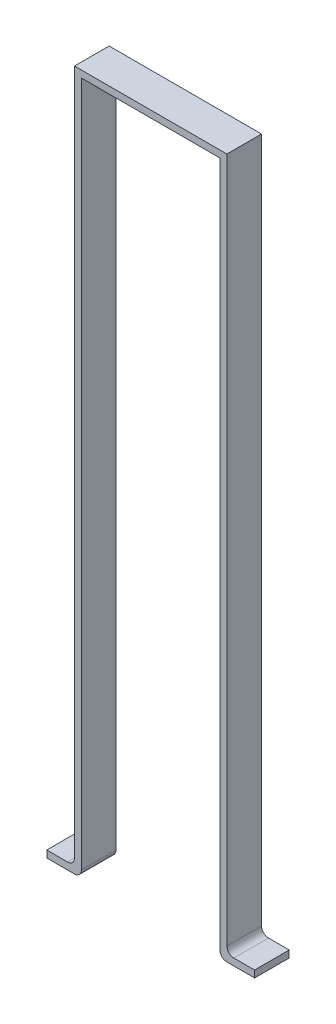
ISO-10303-21;
HEADER;
FILE_DESCRIPTION(('STEP AP214'),'2;1');
FILE_NAME('part.step','',(''),(''),'','','');
FILE_SCHEMA(('AUTOMOTIVE_DESIGN { 1 0 10303 214 1 1 1 1 }'));
ENDSEC;
DATA;
#1=APPLICATION_CONTEXT('core data for automotive mechanical design processes');
#2=APPLICATION_PROTOCOL_DEFINITION('international standard','automotive_design',2000,#1);
#3=PRODUCT_CONTEXT('',#1,'mechanical');
#4=PRODUCT('Part','Part','',(#3));
#5=PRODUCT_RELATED_PRODUCT_CATEGORY('part','',(#4));
#6=PRODUCT_DEFINITION_FORMATION('','',#4);
#7=PRODUCT_DEFINITION_CONTEXT('part definition',#1,'design');
#8=PRODUCT_DEFINITION('design','',#6,#7);
#9=PRODUCT_DEFINITION_SHAPE('','',#8);
#10=(LENGTH_UNIT() NAMED_UNIT(*) SI_UNIT(.MILLI.,.METRE.));
#11=(NAMED_UNIT(*) PLANE_ANGLE_UNIT() SI_UNIT($,.RADIAN.));
#12=(NAMED_UNIT(*) SI_UNIT($,.STERADIAN.) SOLID_ANGLE_UNIT());
#13=UNCERTAINTY_MEASURE_WITH_UNIT(LENGTH_MEASURE(1.E-05),#10,'distance_accuracy_value','');
#14=(GEOMETRIC_REPRESENTATION_CONTEXT(3) GLOBAL_UNCERTAINTY_ASSIGNED_CONTEXT((#13)) GLOBAL_UNIT_ASSIGNED_CONTEXT((#10,
#11,#12)) REPRESENTATION_CONTEXT('',''));
#15=CARTESIAN_POINT('',(0.,0.,0.));
#16=DIRECTION('',(0.,0.,1.));
#17=DIRECTION('',(1.,0.,0.));
#18=AXIS2_PLACEMENT_3D('',#15,#16,#17);
#19=CARTESIAN_POINT('',(-25.4,2.54000000000002,12.7));
#20=DIRECTION('',(-1.,0.,0.));
#21=DIRECTION('',(0.,-1.,0.));
#22=AXIS2_PLACEMENT_3D('',#19,#20,#21);
#23=PLANE('',#22);
#24=DIRECTION('',(0.,1.,0.));
#25=VECTOR('',#24,1.);
#26=CARTESIAN_POINT('',(-25.4,2.54000000000002,0.));
#27=LINE('',#26,#25);
#28=CARTESIAN_POINT('',(-25.4,2.54,0.));
#29=VERTEX_POINT('',#28);
#30=CARTESIAN_POINT('',(-25.4000000000001,254.,0.));
#31=VERTEX_POINT('',#30);
#32=EDGE_CURVE('E176',#29,#31,#27,.T.);
#33=ORIENTED_EDGE('',*,*,#32,.T.);
#34=DIRECTION('',(0.,0.,-1.));
#35=VECTOR('',#34,1.);
#36=CARTESIAN_POINT('',(-25.4000000000001,254.,12.7));
#37=LINE('',#36,#35);
#38=CARTESIAN_POINT('',(-25.4000000000001,254.,12.7));
#39=VERTEX_POINT('',#38);
#40=EDGE_CURVE('E11',#39,#31,#37,.T.);
#41=ORIENTED_EDGE('',*,*,#40,.F.);
#42=DIRECTION('',(0.,1.,0.));
#43=VECTOR('',#42,1.);
#44=CARTESIAN_POINT('',(-25.4,2.54000000000002,12.7));
#45=LINE('',#44,#43);
#46=CARTESIAN_POINT('',(-25.4,2.54,12.7));
#47=VERTEX_POINT('',#46);
#48=EDGE_CURVE('E216',#47,#39,#45,.T.);
#49=ORIENTED_EDGE('',*,*,#48,.F.);
#50=DIRECTION('',(0.,0.,-1.));
#51=VECTOR('',#50,1.);
#52=CARTESIAN_POINT('',(-25.4,2.54,12.7));
#53=LINE('',#52,#51);
#54=EDGE_CURVE('E172',#47,#29,#53,.T.);
#55=ORIENTED_EDGE('',*,*,#54,.T.);
#56=EDGE_LOOP('',(#33,#41,#49,#55));
#57=FACE_BOUND('',#56,.T.);
#58=ADVANCED_FACE('F33',(#57),#23,.F.);
#59=CARTESIAN_POINT('',(-25.4000000000001,254.,12.7));
#60=DIRECTION('',(0.,1.,0.));
#61=DIRECTION('',(0.,0.,1.));
#62=AXIS2_PLACEMENT_3D('',#59,#60,#61);
#63=PLANE('',#62);
#64=DIRECTION('',(1.,0.,0.));
#65=VECTOR('',#64,1.);
#66=CARTESIAN_POINT('',(-25.4000000000001,254.,0.));
#67=LINE('',#66,#65);
#68=CARTESIAN_POINT('',(25.4,254.,0.));
#69=VERTEX_POINT('',#68);
#70=EDGE_CURVE('E179',#31,#69,#67,.T.);
#71=ORIENTED_EDGE('',*,*,#70,.T.);
#72=DIRECTION('',(0.,0.,-1.));
#73=VECTOR('',#72,1.);
#74=CARTESIAN_POINT('',(25.4,254.,12.7));
#75=LINE('',#74,#73);
#76=CARTESIAN_POINT('',(25.4,254.,12.7));
#77=VERTEX_POINT('',#76);
#78=EDGE_CURVE('E41',#77,#69,#75,.T.);
#79=ORIENTED_EDGE('',*,*,#78,.F.);
#80=DIRECTION('',(1.,0.,0.));
#81=VECTOR('',#80,1.);
#82=CARTESIAN_POINT('',(-25.4000000000001,254.,12.7));
#83=LINE('',#82,#81);
#84=EDGE_CURVE('E112',#39,#77,#83,.T.);
#85=ORIENTED_EDGE('',*,*,#84,.F.);
#86=ORIENTED_EDGE('',*,*,#40,.T.);
#87=EDGE_LOOP('',(#71,#79,#85,#86));
#88=FACE_BOUND('',#87,.T.);
#89=ADVANCED_FACE('F306',(#88),#63,.F.);
#90=CARTESIAN_POINT('',(25.4,254.,12.7));
#91=DIRECTION('',(1.,0.,0.));
#92=DIRECTION('',(0.,1.,0.));
#93=AXIS2_PLACEMENT_3D('',#90,#91,#92);
#94=PLANE('',#93);
#95=DIRECTION('',(0.,-1.,0.));
#96=VECTOR('',#95,1.);
#97=CARTESIAN_POINT('',(25.4,254.,0.));
#98=LINE('',#97,#96);
#99=CARTESIAN_POINT('',(25.4,2.54000000000002,0.));
#100=VERTEX_POINT('',#99);
#101=EDGE_CURVE('E181',#69,#100,#98,.T.);
#102=ORIENTED_EDGE('',*,*,#101,.T.);
#103=DIRECTION('',(0.,0.,-1.));
#104=VECTOR('',#103,1.);
#105=CARTESIAN_POINT('',(25.4,2.54000000000002,12.7));
#106=LINE('',#105,#104);
#107=CARTESIAN_POINT('',(25.4,2.54000000000002,12.7));
#108=VERTEX_POINT('',#107);
#109=EDGE_CURVE('E239',#108,#100,#106,.T.);
#110=ORIENTED_EDGE('',*,*,#109,.F.);
#111=DIRECTION('',(0.,-1.,0.));
#112=VECTOR('',#111,1.);
#113=CARTESIAN_POINT('',(25.4,254.,12.7));
#114=LINE('',#113,#112);
#115=EDGE_CURVE('E246',#77,#108,#114,.T.);
#116=ORIENTED_EDGE('',*,*,#115,.F.);
#117=ORIENTED_EDGE('',*,*,#78,.T.);
#118=EDGE_LOOP('',(#102,#110,#116,#117));
#119=FACE_BOUND('',#118,.T.);
#120=ADVANCED_FACE('F244',(#119),#94,.F.);
#121=CARTESIAN_POINT('',(27.94,2.54000000000001,12.7));
#122=DIRECTION('',(0.,0.,-1.));
#123=DIRECTION('',(-1.,0.,0.));
#124=AXIS2_PLACEMENT_3D('',#121,#122,#123);
#125=CYLINDRICAL_SURFACE('',#124,2.54);
#126=CARTESIAN_POINT('',(27.94,2.54000000000001,0.));
#127=DIRECTION('',(0.,0.,-1.));
#128=DIRECTION('',(-1.,0.,0.));
#129=AXIS2_PLACEMENT_3D('',#126,#127,#128);
#130=CIRCLE('',#129,2.54);
#131=CARTESIAN_POINT('',(27.94,0.,0.));
#132=VERTEX_POINT('',#131);
#133=EDGE_CURVE('E184',#132,#100,#130,.T.);
#134=ORIENTED_EDGE('',*,*,#133,.F.);
#135=DIRECTION('',(0.,0.,-1.));
#136=VECTOR('',#135,1.);
#137=CARTESIAN_POINT('',(27.94,0.,12.7));
#138=LINE('',#137,#136);
#139=CARTESIAN_POINT('',(27.94,0.,12.7));
#140=VERTEX_POINT('',#139);
#141=EDGE_CURVE('E237',#140,#132,#138,.T.);
#142=ORIENTED_EDGE('',*,*,#141,.F.);
#143=CARTESIAN_POINT('',(27.94,2.54000000000001,12.7));
#144=DIRECTION('',(0.,0.,-1.));
#145=DIRECTION('',(-1.,0.,0.));
#146=AXIS2_PLACEMENT_3D('',#143,#144,#145);
#147=CIRCLE('',#146,2.54);
#148=EDGE_CURVE('E257',#140,#108,#147,.T.);
#149=ORIENTED_EDGE('',*,*,#148,.T.);
#150=ORIENTED_EDGE('',*,*,#109,.T.);
#151=EDGE_LOOP('',(#134,#142,#149,#150));
#152=FACE_BOUND('',#151,.T.);
#153=ADVANCED_FACE('F253',(#152),#125,.T.);
#154=CARTESIAN_POINT('',(27.94,0.,12.7));
#155=DIRECTION('',(0.,1.,0.));
#156=DIRECTION('',(-1.,0.,0.));
#157=AXIS2_PLACEMENT_3D('',#154,#155,#156);
#158=PLANE('',#157);
#159=DIRECTION('',(1.,0.,0.));
#160=VECTOR('',#159,1.);
#161=CARTESIAN_POINT('',(27.94,0.,0.));
#162=LINE('',#161,#160);
#163=CARTESIAN_POINT('',(38.1,0.,0.));
#164=VERTEX_POINT('',#163);
#165=EDGE_CURVE('E187',#132,#164,#162,.T.);
#166=ORIENTED_EDGE('',*,*,#165,.T.);
#167=DIRECTION('',(0.,0.,-1.));
#168=VECTOR('',#167,1.);
#169=CARTESIAN_POINT('',(38.1,0.,12.7));
#170=LINE('',#169,#168);
#171=CARTESIAN_POINT('',(38.1,0.,12.7));
#172=VERTEX_POINT('',#171);
#173=EDGE_CURVE('E235',#172,#164,#170,.T.);
#174=ORIENTED_EDGE('',*,*,#173,.F.);
#175=DIRECTION('',(1.,0.,0.));
#176=VECTOR('',#175,1.);
#177=CARTESIAN_POINT('',(27.94,0.,12.7));
#178=LINE('',#177,#176);
#179=EDGE_CURVE('E258',#140,#172,#178,.T.);
#180=ORIENTED_EDGE('',*,*,#179,.F.);
#181=ORIENTED_EDGE('',*,*,#141,.T.);
#182=EDGE_LOOP('',(#166,#174,#180,#181));
#183=FACE_BOUND('',#182,.T.);
#184=ADVANCED_FACE('F317',(#183),#158,.F.);
#185=CARTESIAN_POINT('',(38.1,2.54,12.7));
#186=DIRECTION('',(1.,0.,0.));
#187=DIRECTION('',(0.,0.,-1.));
#188=AXIS2_PLACEMENT_3D('',#185,#186,#187);
#189=PLANE('',#188);
#190=DIRECTION('',(0.,-1.,0.));
#191=VECTOR('',#190,1.);
#192=CARTESIAN_POINT('',(38.1,2.54,0.));
#193=LINE('',#192,#191);
#194=CARTESIAN_POINT('',(38.1,2.54,0.));
#195=VERTEX_POINT('',#194);
#196=EDGE_CURVE('E190',#195,#164,#193,.T.);
#197=ORIENTED_EDGE('',*,*,#196,.F.);
#198=DIRECTION('',(0.,0.,-1.));
#199=VECTOR('',#198,1.);
#200=CARTESIAN_POINT('',(38.1,2.54,12.7));
#201=LINE('',#200,#199);
#202=CARTESIAN_POINT('',(38.1,2.54,12.7));
#203=VERTEX_POINT('',#202);
#204=EDGE_CURVE('E233',#203,#195,#201,.T.);
#205=ORIENTED_EDGE('',*,*,#204,.F.);
#206=DIRECTION('',(0.,-1.,0.));
#207=VECTOR('',#206,1.);
#208=CARTESIAN_POINT('',(38.1,2.54,12.7));
#209=LINE('',#208,#207);
#210=EDGE_CURVE('E260',#203,#172,#209,.T.);
#211=ORIENTED_EDGE('',*,*,#210,.T.);
#212=ORIENTED_EDGE('',*,*,#173,.T.);
#213=EDGE_LOOP('',(#197,#205,#211,#212));
#214=FACE_BOUND('',#213,.T.);
#215=ADVANCED_FACE('F320',(#214),#189,.T.);
#216=CARTESIAN_POINT('',(30.48,2.54000000000001,12.7));
#217=DIRECTION('',(0.,1.,0.));
#218=DIRECTION('',(-1.,0.,0.));
#219=AXIS2_PLACEMENT_3D('',#216,#217,#218);
#220=PLANE('',#219);
#221=DIRECTION('',(1.,0.,0.));
#222=VECTOR('',#221,1.);
#223=CARTESIAN_POINT('',(30.48,2.54000000000001,0.));
#224=LINE('',#223,#222);
#225=CARTESIAN_POINT('',(30.48,2.54000000000001,0.));
#226=VERTEX_POINT('',#225);
#227=EDGE_CURVE('E193',#226,#195,#224,.T.);
#228=ORIENTED_EDGE('',*,*,#227,.F.);
#229=DIRECTION('',(0.,0.,-1.));
#230=VECTOR('',#229,1.);
#231=CARTESIAN_POINT('',(30.48,2.54000000000001,12.7));
#232=LINE('',#231,#230);
#233=CARTESIAN_POINT('',(30.48,2.54000000000001,12.7));
#234=VERTEX_POINT('',#233);
#235=EDGE_CURVE('E231',#234,#226,#232,.T.);
#236=ORIENTED_EDGE('',*,*,#235,.F.);
#237=DIRECTION('',(1.,0.,0.));
#238=VECTOR('',#237,1.);
#239=CARTESIAN_POINT('',(30.48,2.54000000000001,12.7));
#240=LINE('',#239,#238);
#241=EDGE_CURVE('E267',#234,#203,#240,.T.);
#242=ORIENTED_EDGE('',*,*,#241,.T.);
#243=ORIENTED_EDGE('',*,*,#204,.T.);
#244=EDGE_LOOP('',(#228,#236,#242,#243));
#245=FACE_BOUND('',#244,.T.);
#246=ADVANCED_FACE('F324',(#245),#220,.T.);
#247=CARTESIAN_POINT('',(30.48,5.08000000000001,12.7));
#248=DIRECTION('',(0.,0.,-1.));
#249=DIRECTION('',(-1.,0.,0.));
#250=AXIS2_PLACEMENT_3D('',#247,#248,#249);
#251=CYLINDRICAL_SURFACE('',#250,2.54);
#252=CARTESIAN_POINT('',(30.48,5.08000000000001,0.));
#253=DIRECTION('',(0.,0.,-1.));
#254=DIRECTION('',(-1.,0.,0.));
#255=AXIS2_PLACEMENT_3D('',#252,#253,#254);
#256=CIRCLE('',#255,2.54);
#257=CARTESIAN_POINT('',(27.94,5.08000000000001,0.));
#258=VERTEX_POINT('',#257);
#259=EDGE_CURVE('E196',#226,#258,#256,.T.);
#260=ORIENTED_EDGE('',*,*,#259,.T.);
#261=DIRECTION('',(0.,0.,-1.));
#262=VECTOR('',#261,1.);
#263=CARTESIAN_POINT('',(27.94,5.08000000000001,12.7));
#264=LINE('',#263,#262);
#265=CARTESIAN_POINT('',(27.94,5.08000000000001,12.7));
#266=VERTEX_POINT('',#265);
#267=EDGE_CURVE('E229',#266,#258,#264,.T.);
#268=ORIENTED_EDGE('',*,*,#267,.F.);
#269=CARTESIAN_POINT('',(30.48,5.08000000000001,12.7));
#270=DIRECTION('',(0.,0.,-1.));
#271=DIRECTION('',(-1.,0.,0.));
#272=AXIS2_PLACEMENT_3D('',#269,#270,#271);
#273=CIRCLE('',#272,2.54);
#274=EDGE_CURVE('E270',#234,#266,#273,.T.);
#275=ORIENTED_EDGE('',*,*,#274,.F.);
#276=ORIENTED_EDGE('',*,*,#235,.T.);
#277=EDGE_LOOP('',(#260,#268,#275,#276));
#278=FACE_BOUND('',#277,.T.);
#279=ADVANCED_FACE('F328',(#278),#251,.F.);
#280=CARTESIAN_POINT('',(27.94,256.54,12.7));
#281=DIRECTION('',(1.,0.,0.));
#282=DIRECTION('',(0.,1.,0.));
#283=AXIS2_PLACEMENT_3D('',#280,#281,#282);
#284=PLANE('',#283);
#285=DIRECTION('',(0.,-1.,0.));
#286=VECTOR('',#285,1.);
#287=CARTESIAN_POINT('',(27.94,256.54,0.));
#288=LINE('',#287,#286);
#289=CARTESIAN_POINT('',(27.94,256.54,0.));
#290=VERTEX_POINT('',#289);
#291=EDGE_CURVE('E199',#290,#258,#288,.T.);
#292=ORIENTED_EDGE('',*,*,#291,.F.);
#293=DIRECTION('',(0.,0.,-1.));
#294=VECTOR('',#293,1.);
#295=CARTESIAN_POINT('',(27.94,256.54,12.7));
#296=LINE('',#295,#294);
#297=CARTESIAN_POINT('',(27.94,256.54,12.7));
#298=VERTEX_POINT('',#297);
#299=EDGE_CURVE('E227',#298,#290,#296,.T.);
#300=ORIENTED_EDGE('',*,*,#299,.F.);
#301=DIRECTION('',(0.,-1.,0.));
#302=VECTOR('',#301,1.);
#303=CARTESIAN_POINT('',(27.94,256.54,12.7));
#304=LINE('',#303,#302);
#305=EDGE_CURVE('E272',#298,#266,#304,.T.);
#306=ORIENTED_EDGE('',*,*,#305,.T.);
#307=ORIENTED_EDGE('',*,*,#267,.T.);
#308=EDGE_LOOP('',(#292,#300,#306,#307));
#309=FACE_BOUND('',#308,.T.);
#310=ADVANCED_FACE('F332',(#309),#284,.T.);
#311=CARTESIAN_POINT('',(-27.94,256.54,12.7));
#312=DIRECTION('',(0.,1.,0.));
#313=DIRECTION('',(0.,0.,1.));
#314=AXIS2_PLACEMENT_3D('',#311,#312,#313);
#315=PLANE('',#314);
#316=DIRECTION('',(1.,0.,0.));
#317=VECTOR('',#316,1.);
#318=CARTESIAN_POINT('',(-27.94,256.54,0.));
#319=LINE('',#318,#317);
#320=CARTESIAN_POINT('',(-27.94,256.54,0.));
#321=VERTEX_POINT('',#320);
#322=EDGE_CURVE('E202',#321,#290,#319,.T.);
#323=ORIENTED_EDGE('',*,*,#322,.F.);
#324=DIRECTION('',(0.,0.,-1.));
#325=VECTOR('',#324,1.);
#326=CARTESIAN_POINT('',(-27.94,256.54,12.7));
#327=LINE('',#326,#325);
#328=CARTESIAN_POINT('',(-27.94,256.54,12.7));
#329=VERTEX_POINT('',#328);
#330=EDGE_CURVE('E225',#329,#321,#327,.T.);
#331=ORIENTED_EDGE('',*,*,#330,.F.);
#332=DIRECTION('',(1.,0.,0.));
#333=VECTOR('',#332,1.);
#334=CARTESIAN_POINT('',(-27.94,256.54,12.7));
#335=LINE('',#334,#333);
#336=EDGE_CURVE('E275',#329,#298,#335,.T.);
#337=ORIENTED_EDGE('',*,*,#336,.T.);
#338=ORIENTED_EDGE('',*,*,#299,.T.);
#339=EDGE_LOOP('',(#323,#331,#337,#338));
#340=FACE_BOUND('',#339,.T.);
#341=ADVANCED_FACE('F336',(#340),#315,.T.);
#342=CARTESIAN_POINT('',(-27.94,5.08000000000002,12.7));
#343=DIRECTION('',(-1.,0.,0.));
#344=DIRECTION('',(0.,0.,1.));
#345=AXIS2_PLACEMENT_3D('',#342,#343,#344);
#346=PLANE('',#345);
#347=DIRECTION('',(0.,1.,0.));
#348=VECTOR('',#347,1.);
#349=CARTESIAN_POINT('',(-27.94,5.08000000000002,0.));
#350=LINE('',#349,#348);
#351=CARTESIAN_POINT('',(-27.94,5.08000000000002,0.));
#352=VERTEX_POINT('',#351);
#353=EDGE_CURVE('E205',#352,#321,#350,.T.);
#354=ORIENTED_EDGE('',*,*,#353,.F.);
#355=DIRECTION('',(0.,0.,-1.));
#356=VECTOR('',#355,1.);
#357=CARTESIAN_POINT('',(-27.94,5.08000000000002,12.7));
#358=LINE('',#357,#356);
#359=CARTESIAN_POINT('',(-27.94,5.08000000000002,12.7));
#360=VERTEX_POINT('',#359);
#361=EDGE_CURVE('E223',#360,#352,#358,.T.);
#362=ORIENTED_EDGE('',*,*,#361,.F.);
#363=DIRECTION('',(0.,1.,0.));
#364=VECTOR('',#363,1.);
#365=CARTESIAN_POINT('',(-27.94,5.08000000000002,12.7));
#366=LINE('',#365,#364);
#367=EDGE_CURVE('E278',#360,#329,#366,.T.);
#368=ORIENTED_EDGE('',*,*,#367,.T.);
#369=ORIENTED_EDGE('',*,*,#330,.T.);
#370=EDGE_LOOP('',(#354,#362,#368,#369));
#371=FACE_BOUND('',#370,.T.);
#372=ADVANCED_FACE('F340',(#371),#346,.T.);
#373=CARTESIAN_POINT('',(-30.48,5.08,12.7));
#374=DIRECTION('',(0.,0.,-1.));
#375=DIRECTION('',(-1.,0.,0.));
#376=AXIS2_PLACEMENT_3D('',#373,#374,#375);
#377=CYLINDRICAL_SURFACE('',#376,2.54);
#378=CARTESIAN_POINT('',(-30.48,5.08,0.));
#379=DIRECTION('',(0.,0.,-1.));
#380=DIRECTION('',(-1.,0.,0.));
#381=AXIS2_PLACEMENT_3D('',#378,#379,#380);
#382=CIRCLE('',#381,2.54);
#383=CARTESIAN_POINT('',(-30.48,2.54,0.));
#384=VERTEX_POINT('',#383);
#385=EDGE_CURVE('E208',#352,#384,#382,.T.);
#386=ORIENTED_EDGE('',*,*,#385,.T.);
#387=DIRECTION('',(0.,0.,-1.));
#388=VECTOR('',#387,1.);
#389=CARTESIAN_POINT('',(-30.48,2.54,12.7));
#390=LINE('',#389,#388);
#391=CARTESIAN_POINT('',(-30.48,2.54,12.7));
#392=VERTEX_POINT('',#391);
#393=EDGE_CURVE('E220',#392,#384,#390,.T.);
#394=ORIENTED_EDGE('',*,*,#393,.F.);
#395=CARTESIAN_POINT('',(-30.48,5.08,12.7));
#396=DIRECTION('',(0.,0.,-1.));
#397=DIRECTION('',(-1.,0.,0.));
#398=AXIS2_PLACEMENT_3D('',#395,#396,#397);
#399=CIRCLE('',#398,2.54);
#400=EDGE_CURVE('E281',#360,#392,#399,.T.);
#401=ORIENTED_EDGE('',*,*,#400,.F.);
#402=ORIENTED_EDGE('',*,*,#361,.T.);
#403=EDGE_LOOP('',(#386,#394,#401,#402));
#404=FACE_BOUND('',#403,.T.);
#405=ADVANCED_FACE('F287',(#404),#377,.F.);
#406=CARTESIAN_POINT('',(-30.48,2.54,12.7));
#407=DIRECTION('',(0.,-1.,0.));
#408=DIRECTION('',(0.,0.,-1.));
#409=AXIS2_PLACEMENT_3D('',#406,#407,#408);
#410=PLANE('',#409);
#411=DIRECTION('',(-1.,0.,0.));
#412=VECTOR('',#411,1.);
#413=CARTESIAN_POINT('',(-30.48,2.54,0.));
#414=LINE('',#413,#412);
#415=CARTESIAN_POINT('',(-38.1,2.54,0.));
#416=VERTEX_POINT('',#415);
#417=EDGE_CURVE('E210',#384,#416,#414,.T.);
#418=ORIENTED_EDGE('',*,*,#417,.T.);
#419=DIRECTION('',(0.,0.,-1.));
#420=VECTOR('',#419,1.);
#421=CARTESIAN_POINT('',(-38.1,2.54,12.7));
#422=LINE('',#421,#420);
#423=CARTESIAN_POINT('',(-38.1,2.54,12.7));
#424=VERTEX_POINT('',#423);
#425=EDGE_CURVE('E168',#424,#416,#422,.T.);
#426=ORIENTED_EDGE('',*,*,#425,.F.);
#427=DIRECTION('',(-1.,0.,0.));
#428=VECTOR('',#427,1.);
#429=CARTESIAN_POINT('',(-30.48,2.54,12.7));
#430=LINE('',#429,#428);
#431=EDGE_CURVE('E155',#392,#424,#430,.T.);
#432=ORIENTED_EDGE('',*,*,#431,.F.);
#433=ORIENTED_EDGE('',*,*,#393,.T.);
#434=EDGE_LOOP('',(#418,#426,#432,#433));
#435=FACE_BOUND('',#434,.T.);
#436=ADVANCED_FACE('F291',(#435),#410,.F.);
#437=CARTESIAN_POINT('',(-38.1,2.54,12.7));
#438=DIRECTION('',(1.,0.,0.));
#439=DIRECTION('',(0.,0.,-1.));
#440=AXIS2_PLACEMENT_3D('',#437,#438,#439);
#441=PLANE('',#440);
#442=DIRECTION('',(0.,-1.,0.));
#443=VECTOR('',#442,1.);
#444=CARTESIAN_POINT('',(-38.1,2.54,0.));
#445=LINE('',#444,#443);
#446=CARTESIAN_POINT('',(-38.1,0.,0.));
#447=VERTEX_POINT('',#446);
#448=EDGE_CURVE('E164',#416,#447,#445,.T.);
#449=ORIENTED_EDGE('',*,*,#448,.T.);
#450=DIRECTION('',(0.,0.,-1.));
#451=VECTOR('',#450,1.);
#452=CARTESIAN_POINT('',(-38.1,0.,12.7));
#453=LINE('',#452,#451);
#454=CARTESIAN_POINT('',(-38.1,0.,12.7));
#455=VERTEX_POINT('',#454);
#456=EDGE_CURVE('E161',#455,#447,#453,.T.);
#457=ORIENTED_EDGE('',*,*,#456,.F.);
#458=DIRECTION('',(0.,-1.,0.));
#459=VECTOR('',#458,1.);
#460=CARTESIAN_POINT('',(-38.1,2.54,12.7));
#461=LINE('',#460,#459);
#462=EDGE_CURVE('E149',#424,#455,#461,.T.);
#463=ORIENTED_EDGE('',*,*,#462,.F.);
#464=ORIENTED_EDGE('',*,*,#425,.T.);
#465=EDGE_LOOP('',(#449,#457,#463,#464));
#466=FACE_BOUND('',#465,.T.);
#467=ADVANCED_FACE('F162',(#466),#441,.F.);
#468=CARTESIAN_POINT('',(-27.94,0.,12.7));
#469=DIRECTION('',(0.,-1.,0.));
#470=DIRECTION('',(1.,0.,0.));
#471=AXIS2_PLACEMENT_3D('',#468,#469,#470);
#472=PLANE('',#471);
#473=DIRECTION('',(-1.,0.,0.));
#474=VECTOR('',#473,1.);
#475=CARTESIAN_POINT('',(-27.94,0.,0.));
#476=LINE('',#475,#474);
#477=CARTESIAN_POINT('',(-27.94,0.,0.));
#478=VERTEX_POINT('',#477);
#479=EDGE_CURVE('E213',#478,#447,#476,.T.);
#480=ORIENTED_EDGE('',*,*,#479,.F.);
#481=DIRECTION('',(0.,0.,-1.));
#482=VECTOR('',#481,1.);
#483=CARTESIAN_POINT('',(-27.94,0.,12.7));
#484=LINE('',#483,#482);
#485=CARTESIAN_POINT('',(-27.94,0.,12.7));
#486=VERTEX_POINT('',#485);
#487=EDGE_CURVE('E101',#486,#478,#484,.T.);
#488=ORIENTED_EDGE('',*,*,#487,.F.);
#489=DIRECTION('',(-1.,0.,0.));
#490=VECTOR('',#489,1.);
#491=CARTESIAN_POINT('',(-27.94,0.,12.7));
#492=LINE('',#491,#490);
#493=EDGE_CURVE('E153',#486,#455,#492,.T.);
#494=ORIENTED_EDGE('',*,*,#493,.T.);
#495=ORIENTED_EDGE('',*,*,#456,.T.);
#496=EDGE_LOOP('',(#480,#488,#494,#495));
#497=FACE_BOUND('',#496,.T.);
#498=ADVANCED_FACE('F170',(#497),#472,.T.);
#499=CARTESIAN_POINT('',(-27.94,2.54,12.7));
#500=DIRECTION('',(0.,0.,-1.));
#501=DIRECTION('',(-1.,0.,0.));
#502=AXIS2_PLACEMENT_3D('',#499,#500,#501);
#503=CYLINDRICAL_SURFACE('',#502,2.54);
#504=CARTESIAN_POINT('',(-27.94,2.54,0.));
#505=DIRECTION('',(0.,0.,1.));
#506=DIRECTION('',(1.,0.,0.));
#507=AXIS2_PLACEMENT_3D('',#504,#505,#506);
#508=CIRCLE('',#507,2.54);
#509=EDGE_CURVE('E104',#478,#29,#508,.T.);
#510=ORIENTED_EDGE('',*,*,#509,.T.);
#511=ORIENTED_EDGE('',*,*,#54,.F.);
#512=CARTESIAN_POINT('',(-27.94,2.54,12.7));
#513=DIRECTION('',(0.,0.,1.));
#514=DIRECTION('',(1.,0.,0.));
#515=AXIS2_PLACEMENT_3D('',#512,#513,#514);
#516=CIRCLE('',#515,2.54);
#517=EDGE_CURVE('E49',#486,#47,#516,.T.);
#518=ORIENTED_EDGE('',*,*,#517,.F.);
#519=ORIENTED_EDGE('',*,*,#487,.T.);
#520=EDGE_LOOP('',(#510,#511,#518,#519));
#521=FACE_BOUND('',#520,.T.);
#522=ADVANCED_FACE('F295',(#521),#503,.T.);
#523=CARTESIAN_POINT('',(27.94,2.54000000000001,12.7));
#524=DIRECTION('',(0.,0.,-1.));
#525=DIRECTION('',(-1.,0.,0.));
#526=AXIS2_PLACEMENT_3D('',#523,#524,#525);
#527=PLANE('',#526);
#528=ORIENTED_EDGE('',*,*,#48,.T.);
#529=ORIENTED_EDGE('',*,*,#84,.T.);
#530=ORIENTED_EDGE('',*,*,#115,.T.);
#531=ORIENTED_EDGE('',*,*,#148,.F.);
#532=ORIENTED_EDGE('',*,*,#179,.T.);
#533=ORIENTED_EDGE('',*,*,#210,.F.);
#534=ORIENTED_EDGE('',*,*,#241,.F.);
#535=ORIENTED_EDGE('',*,*,#274,.T.);
#536=ORIENTED_EDGE('',*,*,#305,.F.);
#537=ORIENTED_EDGE('',*,*,#336,.F.);
#538=ORIENTED_EDGE('',*,*,#367,.F.);
#539=ORIENTED_EDGE('',*,*,#400,.T.);
#540=ORIENTED_EDGE('',*,*,#431,.T.);
#541=ORIENTED_EDGE('',*,*,#462,.T.);
#542=ORIENTED_EDGE('',*,*,#493,.F.);
#543=ORIENTED_EDGE('',*,*,#517,.T.);
#544=EDGE_LOOP('',(#528,#529,#530,#531,#532,#533,#534,#535,#536,#537,#538,#539,#540,#541,#542,#543));
#545=FACE_BOUND('',#544,.T.);
#546=ADVANCED_FACE('F151',(#545),#527,.F.);
#547=CARTESIAN_POINT('',(27.94,2.54000000000001,0.));
#548=DIRECTION('',(0.,0.,-1.));
#549=DIRECTION('',(-1.,0.,0.));
#550=AXIS2_PLACEMENT_3D('',#547,#548,#549);
#551=PLANE('',#550);
#552=ORIENTED_EDGE('',*,*,#32,.F.);
#553=ORIENTED_EDGE('',*,*,#509,.F.);
#554=ORIENTED_EDGE('',*,*,#479,.T.);
#555=ORIENTED_EDGE('',*,*,#448,.F.);
#556=ORIENTED_EDGE('',*,*,#417,.F.);
#557=ORIENTED_EDGE('',*,*,#385,.F.);
#558=ORIENTED_EDGE('',*,*,#353,.T.);
#559=ORIENTED_EDGE('',*,*,#322,.T.);
#560=ORIENTED_EDGE('',*,*,#291,.T.);
#561=ORIENTED_EDGE('',*,*,#259,.F.);
#562=ORIENTED_EDGE('',*,*,#227,.T.);
#563=ORIENTED_EDGE('',*,*,#196,.T.);
#564=ORIENTED_EDGE('',*,*,#165,.F.);
#565=ORIENTED_EDGE('',*,*,#133,.T.);
#566=ORIENTED_EDGE('',*,*,#101,.F.);
#567=ORIENTED_EDGE('',*,*,#70,.F.);
#568=EDGE_LOOP('',(#552,#553,#554,#555,#556,#557,#558,#559,#560,#561,#562,#563,#564,#565,#566,#567));
#569=FACE_BOUND('',#568,.T.);
#570=ADVANCED_FACE('F249',(#569),#551,.T.);
#571=CLOSED_SHELL('',(#58,#89,#120,#153,#184,#215,#246,#279,#310,#341,#372,#405,#436,#467,#498,
#522,#546,#570));
#572=MANIFOLD_SOLID_BREP('B2',#571);
#573=ADVANCED_BREP_SHAPE_REPRESENTATION('',(#18,#572),#14);
#574=SHAPE_DEFINITION_REPRESENTATION(#9,#573);
ENDSEC;
END-ISO-10303-21;
